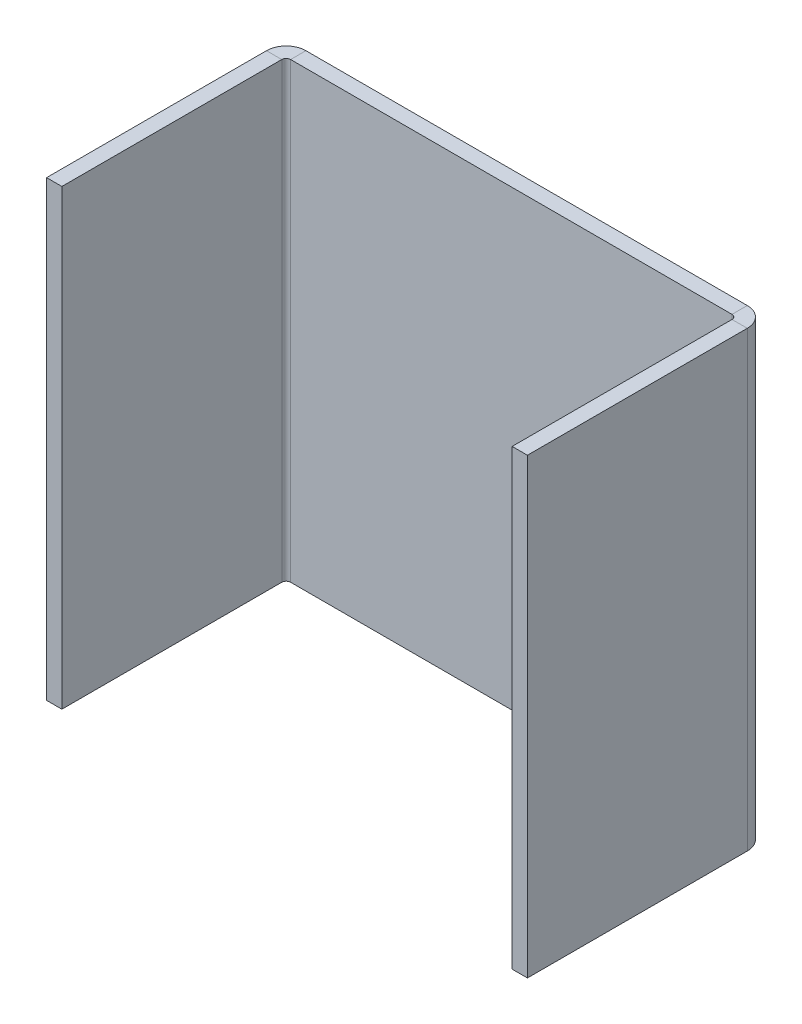
ISO-10303-21;
HEADER;
FILE_DESCRIPTION(('STEP AP214'),'2;1');
FILE_NAME('part.step','',(''),(''),'','','');
FILE_SCHEMA(('AUTOMOTIVE_DESIGN { 1 0 10303 214 1 1 1 1 }'));
ENDSEC;
DATA;
#1=APPLICATION_CONTEXT('core data for automotive mechanical design processes');
#2=APPLICATION_PROTOCOL_DEFINITION('international standard','automotive_design',2000,#1);
#3=PRODUCT_CONTEXT('',#1,'mechanical');
#4=PRODUCT('Part','Part','',(#3));
#5=PRODUCT_RELATED_PRODUCT_CATEGORY('part','',(#4));
#6=PRODUCT_DEFINITION_FORMATION('','',#4);
#7=PRODUCT_DEFINITION_CONTEXT('part definition',#1,'design');
#8=PRODUCT_DEFINITION('design','',#6,#7);
#9=PRODUCT_DEFINITION_SHAPE('','',#8);
#10=(LENGTH_UNIT() NAMED_UNIT(*) SI_UNIT(.MILLI.,.METRE.));
#11=(NAMED_UNIT(*) PLANE_ANGLE_UNIT() SI_UNIT($,.RADIAN.));
#12=(NAMED_UNIT(*) SI_UNIT($,.STERADIAN.) SOLID_ANGLE_UNIT());
#13=UNCERTAINTY_MEASURE_WITH_UNIT(LENGTH_MEASURE(1.E-05),#10,'distance_accuracy_value','');
#14=(GEOMETRIC_REPRESENTATION_CONTEXT(3) GLOBAL_UNCERTAINTY_ASSIGNED_CONTEXT((#13)) GLOBAL_UNIT_ASSIGNED_CONTEXT((#10,
#11,#12)) REPRESENTATION_CONTEXT('',''));
#15=CARTESIAN_POINT('',(0.,0.,0.));
#16=DIRECTION('',(0.,0.,1.));
#17=DIRECTION('',(1.,0.,0.));
#18=AXIS2_PLACEMENT_3D('',#15,#16,#17);
#19=CARTESIAN_POINT('',(76.3360875618202,37.6033561750832,-2.54));
#20=DIRECTION('',(0.,1.,0.));
#21=DIRECTION('',(0.,0.,1.));
#22=AXIS2_PLACEMENT_3D('',#19,#20,#21);
#23=PLANE('',#22);
#24=DIRECTION('',(-1.,0.,0.));
#25=VECTOR('',#24,1.);
#26=CARTESIAN_POINT('',(76.3360875618202,37.6033561750832,0.));
#27=LINE('',#26,#25);
#28=CARTESIAN_POINT('',(36.6601076071468,37.6033561750832,0.));
#29=VERTEX_POINT('',#28);
#30=CARTESIAN_POINT('',(-36.6601076071468,37.6033561750832,0.));
#31=VERTEX_POINT('',#30);
#32=EDGE_CURVE('E72',#29,#31,#27,.T.);
#33=ORIENTED_EDGE('',*,*,#32,.F.);
#34=DIRECTION('',(0.,0.,-1.));
#35=VECTOR('',#34,1.);
#36=CARTESIAN_POINT('',(36.6601076071468,37.6033561750832,-2.54));
#37=LINE('',#36,#35);
#38=CARTESIAN_POINT('',(36.6601076071469,37.6033561750832,-2.54));
#39=VERTEX_POINT('',#38);
#40=EDGE_CURVE('E243',#29,#39,#37,.T.);
#41=ORIENTED_EDGE('',*,*,#40,.T.);
#42=DIRECTION('',(-1.,0.,0.));
#43=VECTOR('',#42,1.);
#44=CARTESIAN_POINT('',(76.3360875618202,37.6033561750832,-2.54));
#45=LINE('',#44,#43);
#46=CARTESIAN_POINT('',(-36.6601076071468,37.6033561750832,-2.54));
#47=VERTEX_POINT('',#46);
#48=EDGE_CURVE('E51',#39,#47,#45,.T.);
#49=ORIENTED_EDGE('',*,*,#48,.T.);
#50=DIRECTION('',(0.,0.,-1.));
#51=VECTOR('',#50,1.);
#52=CARTESIAN_POINT('',(-36.6601076071469,37.6033561750832,-2.54));
#53=LINE('',#52,#51);
#54=EDGE_CURVE('E238',#31,#47,#53,.T.);
#55=ORIENTED_EDGE('',*,*,#54,.F.);
#56=EDGE_LOOP('',(#33,#41,#49,#55));
#57=FACE_BOUND('',#56,.T.);
#58=ADVANCED_FACE('F47',(#57),#23,.T.);
#59=CARTESIAN_POINT('',(76.3360875618202,-37.6033561750832,-2.54));
#60=DIRECTION('',(0.,-1.,0.));
#61=DIRECTION('',(0.,0.,-1.));
#62=AXIS2_PLACEMENT_3D('',#59,#60,#61);
#63=PLANE('',#62);
#64=DIRECTION('',(1.,0.,0.));
#65=VECTOR('',#64,1.);
#66=CARTESIAN_POINT('',(76.3360875618202,-37.6033561750832,-2.54));
#67=LINE('',#66,#65);
#68=CARTESIAN_POINT('',(-36.6601076071468,-37.6033561750832,-2.54));
#69=VERTEX_POINT('',#68);
#70=CARTESIAN_POINT('',(36.6601076071469,-37.6033561750832,-2.54));
#71=VERTEX_POINT('',#70);
#72=EDGE_CURVE('E247',#69,#71,#67,.T.);
#73=ORIENTED_EDGE('',*,*,#72,.T.);
#74=DIRECTION('',(0.,0.,1.));
#75=VECTOR('',#74,1.);
#76=CARTESIAN_POINT('',(36.6601076071469,-37.6033561750832,-2.54));
#77=LINE('',#76,#75);
#78=CARTESIAN_POINT('',(36.6601076071469,-37.6033561750832,0.));
#79=VERTEX_POINT('',#78);
#80=EDGE_CURVE('E12',#71,#79,#77,.T.);
#81=ORIENTED_EDGE('',*,*,#80,.T.);
#82=DIRECTION('',(1.,0.,0.));
#83=VECTOR('',#82,1.);
#84=CARTESIAN_POINT('',(76.3360875618202,-37.6033561750832,0.));
#85=LINE('',#84,#83);
#86=CARTESIAN_POINT('',(-36.6601076071468,-37.6033561750832,0.));
#87=VERTEX_POINT('',#86);
#88=EDGE_CURVE('E225',#87,#79,#85,.T.);
#89=ORIENTED_EDGE('',*,*,#88,.F.);
#90=DIRECTION('',(0.,0.,1.));
#91=VECTOR('',#90,1.);
#92=CARTESIAN_POINT('',(-36.6601076071468,-37.6033561750832,-2.54));
#93=LINE('',#92,#91);
#94=EDGE_CURVE('E232',#69,#87,#93,.T.);
#95=ORIENTED_EDGE('',*,*,#94,.F.);
#96=EDGE_LOOP('',(#73,#81,#89,#95));
#97=FACE_BOUND('',#96,.T.);
#98=ADVANCED_FACE('F49',(#97),#63,.T.);
#99=CARTESIAN_POINT('',(0.,0.,0.));
#100=DIRECTION('',(0.,0.,1.));
#101=DIRECTION('',(1.,0.,0.));
#102=AXIS2_PLACEMENT_3D('',#99,#100,#101);
#103=PLANE('',#102);
#104=ORIENTED_EDGE('',*,*,#88,.T.);
#105=DIRECTION('',(0.,1.,0.));
#106=VECTOR('',#105,1.);
#107=CARTESIAN_POINT('',(36.6601076071469,0.,0.));
#108=LINE('',#107,#106);
#109=EDGE_CURVE('E56',#79,#29,#108,.T.);
#110=ORIENTED_EDGE('',*,*,#109,.T.);
#111=ORIENTED_EDGE('',*,*,#32,.T.);
#112=DIRECTION('',(0.,1.,0.));
#113=VECTOR('',#112,1.);
#114=CARTESIAN_POINT('',(-36.6601076071468,0.,0.));
#115=LINE('',#114,#113);
#116=EDGE_CURVE('E235',#87,#31,#115,.T.);
#117=ORIENTED_EDGE('',*,*,#116,.F.);
#118=EDGE_LOOP('',(#104,#110,#111,#117));
#119=FACE_BOUND('',#118,.T.);
#120=ADVANCED_FACE('F251',(#119),#103,.T.);
#121=CARTESIAN_POINT('',(0.,0.,-2.54));
#122=DIRECTION('',(0.,0.,1.));
#123=DIRECTION('',(1.,0.,0.));
#124=AXIS2_PLACEMENT_3D('',#121,#122,#123);
#125=PLANE('',#124);
#126=DIRECTION('',(0.,1.,0.));
#127=VECTOR('',#126,1.);
#128=CARTESIAN_POINT('',(36.6601076071469,0.,-2.54));
#129=LINE('',#128,#127);
#130=EDGE_CURVE('E241',#71,#39,#129,.T.);
#131=ORIENTED_EDGE('',*,*,#130,.F.);
#132=ORIENTED_EDGE('',*,*,#72,.F.);
#133=DIRECTION('',(0.,1.,0.));
#134=VECTOR('',#133,1.);
#135=CARTESIAN_POINT('',(-36.6601076071468,0.,-2.54));
#136=LINE('',#135,#134);
#137=EDGE_CURVE('E230',#69,#47,#136,.T.);
#138=ORIENTED_EDGE('',*,*,#137,.T.);
#139=ORIENTED_EDGE('',*,*,#48,.F.);
#140=EDGE_LOOP('',(#131,#132,#138,#139));
#141=FACE_BOUND('',#140,.T.);
#142=ADVANCED_FACE('F262',(#141),#125,.F.);
#143=CARTESIAN_POINT('',(-36.6601076071468,-37.6033561750832,0.7366));
#144=DIRECTION('',(0.,-1.,0.));
#145=DIRECTION('',(0.,0.,-1.));
#146=AXIS2_PLACEMENT_3D('',#143,#144,#145);
#147=PLANE('',#146);
#148=ORIENTED_EDGE('',*,*,#94,.T.);
#149=CARTESIAN_POINT('',(-36.6601076071468,-37.6033561750832,0.7366));
#150=DIRECTION('',(0.,1.,0.));
#151=DIRECTION('',(-1.,0.,0.));
#152=AXIS2_PLACEMENT_3D('',#149,#150,#151);
#153=CIRCLE('',#152,0.7366);
#154=CARTESIAN_POINT('',(-37.3967076071468,-37.6033561750832,0.736600000000004));
#155=VERTEX_POINT('',#154);
#156=EDGE_CURVE('E190',#87,#155,#153,.T.);
#157=ORIENTED_EDGE('',*,*,#156,.T.);
#158=DIRECTION('',(1.,0.,0.));
#159=VECTOR('',#158,1.);
#160=CARTESIAN_POINT('',(-39.9367076071468,-37.6033561750832,0.736600000000011));
#161=LINE('',#160,#159);
#162=CARTESIAN_POINT('',(-39.9367076071468,-37.6033561750832,0.736600000000025));
#163=VERTEX_POINT('',#162);
#164=EDGE_CURVE('E205',#163,#155,#161,.T.);
#165=ORIENTED_EDGE('',*,*,#164,.F.);
#166=CARTESIAN_POINT('',(-36.6601076071468,-37.6033561750832,0.7366));
#167=DIRECTION('',(0.,1.,0.));
#168=DIRECTION('',(0.,0.,-1.));
#169=AXIS2_PLACEMENT_3D('',#166,#167,#168);
#170=CIRCLE('',#169,3.2766);
#171=EDGE_CURVE('E218',#69,#163,#170,.T.);
#172=ORIENTED_EDGE('',*,*,#171,.F.);
#173=EDGE_LOOP('',(#148,#157,#165,#172));
#174=FACE_BOUND('',#173,.T.);
#175=ADVANCED_FACE('F302',(#174),#147,.T.);
#176=CARTESIAN_POINT('',(-36.6601076071468,37.6033561750832,0.7366));
#177=DIRECTION('',(0.,1.,0.));
#178=DIRECTION('',(0.,0.,1.));
#179=AXIS2_PLACEMENT_3D('',#176,#177,#178);
#180=PLANE('',#179);
#181=DIRECTION('',(-1.,0.,0.));
#182=VECTOR('',#181,1.);
#183=CARTESIAN_POINT('',(-39.9367076071468,37.6033561750832,0.736600000000011));
#184=LINE('',#183,#182);
#185=CARTESIAN_POINT('',(-37.3967076071468,37.6033561750832,0.736600000000004));
#186=VERTEX_POINT('',#185);
#187=CARTESIAN_POINT('',(-39.9367076071469,37.6033561750832,0.736600000000017));
#188=VERTEX_POINT('',#187);
#189=EDGE_CURVE('E193',#186,#188,#184,.T.);
#190=ORIENTED_EDGE('',*,*,#189,.F.);
#191=CARTESIAN_POINT('',(-36.6601076071468,37.6033561750832,0.7366));
#192=DIRECTION('',(0.,1.,0.));
#193=DIRECTION('',(-1.,0.,0.));
#194=AXIS2_PLACEMENT_3D('',#191,#192,#193);
#195=CIRCLE('',#194,0.7366);
#196=EDGE_CURVE('E222',#186,#31,#195,.F.);
#197=ORIENTED_EDGE('',*,*,#196,.T.);
#198=ORIENTED_EDGE('',*,*,#54,.T.);
#199=CARTESIAN_POINT('',(-36.6601076071468,37.6033561750832,0.7366));
#200=DIRECTION('',(0.,-1.,0.));
#201=DIRECTION('',(0.,0.,1.));
#202=AXIS2_PLACEMENT_3D('',#199,#200,#201);
#203=CIRCLE('',#202,3.2766);
#204=EDGE_CURVE('E221',#188,#47,#203,.T.);
#205=ORIENTED_EDGE('',*,*,#204,.F.);
#206=EDGE_LOOP('',(#190,#197,#198,#205));
#207=FACE_BOUND('',#206,.T.);
#208=ADVANCED_FACE('F306',(#207),#180,.T.);
#209=CARTESIAN_POINT('',(-36.6601076071468,-75.315576302587,0.7366));
#210=DIRECTION('',(0.,1.,0.));
#211=DIRECTION('',(-1.,0.,0.));
#212=AXIS2_PLACEMENT_3D('',#209,#210,#211);
#213=CYLINDRICAL_SURFACE('',#212,3.2766);
#214=ORIENTED_EDGE('',*,*,#204,.T.);
#215=ORIENTED_EDGE('',*,*,#137,.F.);
#216=ORIENTED_EDGE('',*,*,#171,.T.);
#217=DIRECTION('',(0.,1.,0.));
#218=VECTOR('',#217,1.);
#219=CARTESIAN_POINT('',(-39.9367076071468,0.,0.736600000000018));
#220=LINE('',#219,#218);
#221=EDGE_CURVE('E183',#163,#188,#220,.T.);
#222=ORIENTED_EDGE('',*,*,#221,.T.);
#223=EDGE_LOOP('',(#214,#215,#216,#222));
#224=FACE_BOUND('',#223,.T.);
#225=ADVANCED_FACE('F311',(#224),#213,.T.);
#226=CARTESIAN_POINT('',(-36.6601076071468,-75.315576302587,0.7366));
#227=DIRECTION('',(0.,1.,0.));
#228=DIRECTION('',(-1.,0.,0.));
#229=AXIS2_PLACEMENT_3D('',#226,#227,#228);
#230=CYLINDRICAL_SURFACE('',#229,0.7366);
#231=ORIENTED_EDGE('',*,*,#196,.F.);
#232=DIRECTION('',(0.,1.,0.));
#233=VECTOR('',#232,1.);
#234=CARTESIAN_POINT('',(-37.3967076071468,0.,0.736600000000011));
#235=LINE('',#234,#233);
#236=EDGE_CURVE('E200',#155,#186,#235,.T.);
#237=ORIENTED_EDGE('',*,*,#236,.F.);
#238=ORIENTED_EDGE('',*,*,#156,.F.);
#239=ORIENTED_EDGE('',*,*,#116,.T.);
#240=EDGE_LOOP('',(#231,#237,#238,#239));
#241=FACE_BOUND('',#240,.T.);
#242=ADVANCED_FACE('F315',(#241),#230,.F.);
#243=CARTESIAN_POINT('',(-39.9367076071467,-37.6033561750832,37.2606200453267));
#244=DIRECTION('',(0.,0.,1.));
#245=DIRECTION('',(1.,0.,0.));
#246=AXIS2_PLACEMENT_3D('',#243,#244,#245);
#247=PLANE('',#246);
#248=DIRECTION('',(0.,-1.,0.));
#249=VECTOR('',#248,1.);
#250=CARTESIAN_POINT('',(-37.3967076071467,-37.6033561750832,37.2606200453267));
#251=LINE('',#250,#249);
#252=CARTESIAN_POINT('',(-37.3967076071467,37.6033561750832,37.2606200453267));
#253=VERTEX_POINT('',#252);
#254=CARTESIAN_POINT('',(-37.3967076071467,-37.6033561750832,37.2606200453267));
#255=VERTEX_POINT('',#254);
#256=EDGE_CURVE('E195',#253,#255,#251,.T.);
#257=ORIENTED_EDGE('',*,*,#256,.F.);
#258=DIRECTION('',(1.,0.,0.));
#259=VECTOR('',#258,1.);
#260=CARTESIAN_POINT('',(-39.9367076071467,37.6033561750832,37.2606200453267));
#261=LINE('',#260,#259);
#262=CARTESIAN_POINT('',(-39.9367076071467,37.6033561750832,37.2606200453267));
#263=VERTEX_POINT('',#262);
#264=EDGE_CURVE('E187',#263,#253,#261,.T.);
#265=ORIENTED_EDGE('',*,*,#264,.F.);
#266=DIRECTION('',(0.,-1.,0.));
#267=VECTOR('',#266,1.);
#268=CARTESIAN_POINT('',(-39.9367076071467,-37.6033561750832,37.2606200453267));
#269=LINE('',#268,#267);
#270=CARTESIAN_POINT('',(-39.9367076071467,-37.6033561750832,37.2606200453267));
#271=VERTEX_POINT('',#270);
#272=EDGE_CURVE('E213',#263,#271,#269,.T.);
#273=ORIENTED_EDGE('',*,*,#272,.T.);
#274=DIRECTION('',(1.,0.,0.));
#275=VECTOR('',#274,1.);
#276=CARTESIAN_POINT('',(-39.9367076071467,-37.6033561750832,37.2606200453267));
#277=LINE('',#276,#275);
#278=EDGE_CURVE('E211',#271,#255,#277,.T.);
#279=ORIENTED_EDGE('',*,*,#278,.T.);
#280=EDGE_LOOP('',(#257,#265,#273,#279));
#281=FACE_BOUND('',#280,.T.);
#282=ADVANCED_FACE('F318',(#281),#247,.T.);
#283=CARTESIAN_POINT('',(-39.936707607147,0.,-39.0754675164935));
#284=DIRECTION('',(1.,0.,0.));
#285=DIRECTION('',(0.,0.,-1.));
#286=AXIS2_PLACEMENT_3D('',#283,#284,#285);
#287=PLANE('',#286);
#288=ORIENTED_EDGE('',*,*,#221,.F.);
#289=DIRECTION('',(0.,0.,-1.));
#290=VECTOR('',#289,1.);
#291=CARTESIAN_POINT('',(-39.9367076071472,-37.6033561750832,-115.411555078314));
#292=LINE('',#291,#290);
#293=EDGE_CURVE('E208',#271,#163,#292,.T.);
#294=ORIENTED_EDGE('',*,*,#293,.F.);
#295=ORIENTED_EDGE('',*,*,#272,.F.);
#296=DIRECTION('',(0.,0.,1.));
#297=VECTOR('',#296,1.);
#298=CARTESIAN_POINT('',(-39.9367076071472,37.6033561750832,-115.411555078314));
#299=LINE('',#298,#297);
#300=EDGE_CURVE('E191',#188,#263,#299,.T.);
#301=ORIENTED_EDGE('',*,*,#300,.F.);
#302=EDGE_LOOP('',(#288,#294,#295,#301));
#303=FACE_BOUND('',#302,.T.);
#304=ADVANCED_FACE('F334',(#303),#287,.F.);
#305=CARTESIAN_POINT('',(-39.9367076071472,-37.6033561750832,-115.411555078314));
#306=DIRECTION('',(0.,-1.,0.));
#307=DIRECTION('',(-1.,0.,0.));
#308=AXIS2_PLACEMENT_3D('',#305,#306,#307);
#309=PLANE('',#308);
#310=ORIENTED_EDGE('',*,*,#293,.T.);
#311=ORIENTED_EDGE('',*,*,#164,.T.);
#312=DIRECTION('',(0.,0.,-1.));
#313=VECTOR('',#312,1.);
#314=CARTESIAN_POINT('',(-37.3967076071472,-37.6033561750832,-115.411555078314));
#315=LINE('',#314,#313);
#316=EDGE_CURVE('E203',#255,#155,#315,.T.);
#317=ORIENTED_EDGE('',*,*,#316,.F.);
#318=ORIENTED_EDGE('',*,*,#278,.F.);
#319=EDGE_LOOP('',(#310,#311,#317,#318));
#320=FACE_BOUND('',#319,.T.);
#321=ADVANCED_FACE('F330',(#320),#309,.T.);
#322=CARTESIAN_POINT('',(-37.396707607147,0.,-39.0754675164935));
#323=DIRECTION('',(1.,0.,0.));
#324=DIRECTION('',(0.,0.,-1.));
#325=AXIS2_PLACEMENT_3D('',#322,#323,#324);
#326=PLANE('',#325);
#327=ORIENTED_EDGE('',*,*,#316,.T.);
#328=ORIENTED_EDGE('',*,*,#236,.T.);
#329=DIRECTION('',(0.,0.,1.));
#330=VECTOR('',#329,1.);
#331=CARTESIAN_POINT('',(-37.3967076071472,37.6033561750832,-115.411555078314));
#332=LINE('',#331,#330);
#333=EDGE_CURVE('E198',#186,#253,#332,.T.);
#334=ORIENTED_EDGE('',*,*,#333,.T.);
#335=ORIENTED_EDGE('',*,*,#256,.T.);
#336=EDGE_LOOP('',(#327,#328,#334,#335));
#337=FACE_BOUND('',#336,.T.);
#338=ADVANCED_FACE('F326',(#337),#326,.T.);
#339=CARTESIAN_POINT('',(-39.9367076071472,37.6033561750832,-115.411555078314));
#340=DIRECTION('',(0.,1.,0.));
#341=DIRECTION('',(1.,0.,0.));
#342=AXIS2_PLACEMENT_3D('',#339,#340,#341);
#343=PLANE('',#342);
#344=ORIENTED_EDGE('',*,*,#333,.F.);
#345=ORIENTED_EDGE('',*,*,#189,.T.);
#346=ORIENTED_EDGE('',*,*,#300,.T.);
#347=ORIENTED_EDGE('',*,*,#264,.T.);
#348=EDGE_LOOP('',(#344,#345,#346,#347));
#349=FACE_BOUND('',#348,.T.);
#350=ADVANCED_FACE('F323',(#349),#343,.T.);
#351=CARTESIAN_POINT('',(36.6601076071469,-37.6033561750832,0.7366));
#352=DIRECTION('',(0.,-1.,0.));
#353=DIRECTION('',(0.,0.,-1.));
#354=AXIS2_PLACEMENT_3D('',#351,#352,#353);
#355=PLANE('',#354);
#356=DIRECTION('',(-1.,0.,0.));
#357=VECTOR('',#356,1.);
#358=CARTESIAN_POINT('',(39.9367076071469,-37.6033561750832,0.736600000000011));
#359=LINE('',#358,#357);
#360=CARTESIAN_POINT('',(39.9367076071469,-37.6033561750832,0.736600000000011));
#361=VERTEX_POINT('',#360);
#362=CARTESIAN_POINT('',(37.3967076071469,-37.6033561750832,0.73659999999999));
#363=VERTEX_POINT('',#362);
#364=EDGE_CURVE('E146',#361,#363,#359,.T.);
#365=ORIENTED_EDGE('',*,*,#364,.T.);
#366=CARTESIAN_POINT('',(36.6601076071469,-37.6033561750832,0.7366));
#367=DIRECTION('',(0.,-1.,0.));
#368=DIRECTION('',(1.,0.,0.));
#369=AXIS2_PLACEMENT_3D('',#366,#367,#368);
#370=CIRCLE('',#369,0.7366);
#371=EDGE_CURVE('E64',#363,#79,#370,.F.);
#372=ORIENTED_EDGE('',*,*,#371,.T.);
#373=ORIENTED_EDGE('',*,*,#80,.F.);
#374=CARTESIAN_POINT('',(36.6601076071469,-37.6033561750832,0.7366));
#375=DIRECTION('',(0.,1.,0.));
#376=DIRECTION('',(0.,0.,-1.));
#377=AXIS2_PLACEMENT_3D('',#374,#375,#376);
#378=CIRCLE('',#377,3.2766);
#379=EDGE_CURVE('E176',#361,#71,#378,.T.);
#380=ORIENTED_EDGE('',*,*,#379,.F.);
#381=EDGE_LOOP('',(#365,#372,#373,#380));
#382=FACE_BOUND('',#381,.T.);
#383=ADVANCED_FACE('F254',(#382),#355,.T.);
#384=CARTESIAN_POINT('',(36.6601076071468,37.6033561750832,0.7366));
#385=DIRECTION('',(0.,1.,0.));
#386=DIRECTION('',(0.,0.,1.));
#387=AXIS2_PLACEMENT_3D('',#384,#385,#386);
#388=PLANE('',#387);
#389=ORIENTED_EDGE('',*,*,#40,.F.);
#390=CARTESIAN_POINT('',(36.6601076071468,37.6033561750832,0.7366));
#391=DIRECTION('',(0.,-1.,0.));
#392=DIRECTION('',(1.,0.,0.));
#393=AXIS2_PLACEMENT_3D('',#390,#391,#392);
#394=CIRCLE('',#393,0.7366);
#395=CARTESIAN_POINT('',(37.3967076071468,37.6033561750832,0.736600000000018));
#396=VERTEX_POINT('',#395);
#397=EDGE_CURVE('E180',#29,#396,#394,.T.);
#398=ORIENTED_EDGE('',*,*,#397,.T.);
#399=DIRECTION('',(1.,0.,0.));
#400=VECTOR('',#399,1.);
#401=CARTESIAN_POINT('',(39.9367076071468,37.6033561750832,0.736600000000011));
#402=LINE('',#401,#400);
#403=CARTESIAN_POINT('',(39.9367076071469,37.6033561750832,0.73660000000004));
#404=VERTEX_POINT('',#403);
#405=EDGE_CURVE('E164',#396,#404,#402,.T.);
#406=ORIENTED_EDGE('',*,*,#405,.T.);
#407=CARTESIAN_POINT('',(36.6601076071468,37.6033561750832,0.7366));
#408=DIRECTION('',(0.,-1.,0.));
#409=DIRECTION('',(0.,0.,1.));
#410=AXIS2_PLACEMENT_3D('',#407,#408,#409);
#411=CIRCLE('',#410,3.2766);
#412=EDGE_CURVE('E179',#39,#404,#411,.T.);
#413=ORIENTED_EDGE('',*,*,#412,.F.);
#414=EDGE_LOOP('',(#389,#398,#406,#413));
#415=FACE_BOUND('',#414,.T.);
#416=ADVANCED_FACE('F268',(#415),#388,.T.);
#417=CARTESIAN_POINT('',(36.6601076071468,75.315576302587,0.7366));
#418=DIRECTION('',(0.,-1.,0.));
#419=DIRECTION('',(1.,0.,0.));
#420=AXIS2_PLACEMENT_3D('',#417,#418,#419);
#421=CYLINDRICAL_SURFACE('',#420,3.2766);
#422=ORIENTED_EDGE('',*,*,#412,.T.);
#423=DIRECTION('',(0.,1.,0.));
#424=VECTOR('',#423,1.);
#425=CARTESIAN_POINT('',(39.9367076071469,0.,0.736600000000011));
#426=LINE('',#425,#424);
#427=EDGE_CURVE('E166',#361,#404,#426,.T.);
#428=ORIENTED_EDGE('',*,*,#427,.F.);
#429=ORIENTED_EDGE('',*,*,#379,.T.);
#430=ORIENTED_EDGE('',*,*,#130,.T.);
#431=EDGE_LOOP('',(#422,#428,#429,#430));
#432=FACE_BOUND('',#431,.T.);
#433=ADVANCED_FACE('F258',(#432),#421,.T.);
#434=CARTESIAN_POINT('',(36.6601076071468,75.315576302587,0.7366));
#435=DIRECTION('',(0.,-1.,0.));
#436=DIRECTION('',(1.,0.,0.));
#437=AXIS2_PLACEMENT_3D('',#434,#435,#436);
#438=CYLINDRICAL_SURFACE('',#437,0.7366);
#439=ORIENTED_EDGE('',*,*,#397,.F.);
#440=ORIENTED_EDGE('',*,*,#109,.F.);
#441=ORIENTED_EDGE('',*,*,#371,.F.);
#442=DIRECTION('',(0.,1.,0.));
#443=VECTOR('',#442,1.);
#444=CARTESIAN_POINT('',(37.3967076071469,0.,0.736600000000004));
#445=LINE('',#444,#443);
#446=EDGE_CURVE('E169',#363,#396,#445,.T.);
#447=ORIENTED_EDGE('',*,*,#446,.T.);
#448=EDGE_LOOP('',(#439,#440,#441,#447));
#449=FACE_BOUND('',#448,.T.);
#450=ADVANCED_FACE('F270',(#449),#438,.F.);
#451=CARTESIAN_POINT('',(39.9367076071467,-37.6033561750832,37.2606200453267));
#452=DIRECTION('',(0.,0.,1.));
#453=DIRECTION('',(1.,0.,0.));
#454=AXIS2_PLACEMENT_3D('',#451,#452,#453);
#455=PLANE('',#454);
#456=DIRECTION('',(0.,1.,0.));
#457=VECTOR('',#456,1.);
#458=CARTESIAN_POINT('',(37.3967076071467,-37.6033561750832,37.2606200453267));
#459=LINE('',#458,#457);
#460=CARTESIAN_POINT('',(37.3967076071467,-37.6033561750832,37.2606200453267));
#461=VERTEX_POINT('',#460);
#462=CARTESIAN_POINT('',(37.3967076071467,37.6033561750832,37.2606200453267));
#463=VERTEX_POINT('',#462);
#464=EDGE_CURVE('E159',#461,#463,#459,.T.);
#465=ORIENTED_EDGE('',*,*,#464,.F.);
#466=DIRECTION('',(-1.,0.,0.));
#467=VECTOR('',#466,1.);
#468=CARTESIAN_POINT('',(39.9367076071467,-37.6033561750832,37.2606200453267));
#469=LINE('',#468,#467);
#470=CARTESIAN_POINT('',(39.9367076071467,-37.6033561750832,37.2606200453267));
#471=VERTEX_POINT('',#470);
#472=EDGE_CURVE('E144',#471,#461,#469,.T.);
#473=ORIENTED_EDGE('',*,*,#472,.F.);
#474=DIRECTION('',(0.,1.,0.));
#475=VECTOR('',#474,1.);
#476=CARTESIAN_POINT('',(39.9367076071467,-37.6033561750832,37.2606200453267));
#477=LINE('',#476,#475);
#478=CARTESIAN_POINT('',(39.9367076071467,37.6033561750832,37.2606200453267));
#479=VERTEX_POINT('',#478);
#480=EDGE_CURVE('E156',#471,#479,#477,.T.);
#481=ORIENTED_EDGE('',*,*,#480,.T.);
#482=DIRECTION('',(-1.,0.,0.));
#483=VECTOR('',#482,1.);
#484=CARTESIAN_POINT('',(39.9367076071467,37.6033561750832,37.2606200453267));
#485=LINE('',#484,#483);
#486=EDGE_CURVE('E163',#479,#463,#485,.T.);
#487=ORIENTED_EDGE('',*,*,#486,.T.);
#488=EDGE_LOOP('',(#465,#473,#481,#487));
#489=FACE_BOUND('',#488,.T.);
#490=ADVANCED_FACE('F155',(#489),#455,.T.);
#491=CARTESIAN_POINT('',(39.936707607147,0.,-39.0754675164935));
#492=DIRECTION('',(-1.,0.,0.));
#493=DIRECTION('',(0.,0.,1.));
#494=AXIS2_PLACEMENT_3D('',#491,#492,#493);
#495=PLANE('',#494);
#496=DIRECTION('',(0.,0.,1.));
#497=VECTOR('',#496,1.);
#498=CARTESIAN_POINT('',(39.9367076071467,-37.6033561750832,37.2606200453267));
#499=LINE('',#498,#497);
#500=EDGE_CURVE('E141',#361,#471,#499,.T.);
#501=ORIENTED_EDGE('',*,*,#500,.F.);
#502=ORIENTED_EDGE('',*,*,#427,.T.);
#503=DIRECTION('',(0.,0.,-1.));
#504=VECTOR('',#503,1.);
#505=CARTESIAN_POINT('',(39.9367076071467,37.6033561750832,37.2606200453267));
#506=LINE('',#505,#504);
#507=EDGE_CURVE('E162',#479,#404,#506,.T.);
#508=ORIENTED_EDGE('',*,*,#507,.F.);
#509=ORIENTED_EDGE('',*,*,#480,.F.);
#510=EDGE_LOOP('',(#501,#502,#508,#509));
#511=FACE_BOUND('',#510,.T.);
#512=ADVANCED_FACE('F161',(#511),#495,.F.);
#513=CARTESIAN_POINT('',(39.9367076071467,37.6033561750832,37.2606200453267));
#514=DIRECTION('',(0.,1.,0.));
#515=DIRECTION('',(-1.,0.,0.));
#516=AXIS2_PLACEMENT_3D('',#513,#514,#515);
#517=PLANE('',#516);
#518=ORIENTED_EDGE('',*,*,#405,.F.);
#519=DIRECTION('',(0.,0.,-1.));
#520=VECTOR('',#519,1.);
#521=CARTESIAN_POINT('',(37.3967076071467,37.6033561750832,37.2606200453267));
#522=LINE('',#521,#520);
#523=EDGE_CURVE('E151',#463,#396,#522,.T.);
#524=ORIENTED_EDGE('',*,*,#523,.F.);
#525=ORIENTED_EDGE('',*,*,#486,.F.);
#526=ORIENTED_EDGE('',*,*,#507,.T.);
#527=EDGE_LOOP('',(#518,#524,#525,#526));
#528=FACE_BOUND('',#527,.T.);
#529=ADVANCED_FACE('F279',(#528),#517,.T.);
#530=CARTESIAN_POINT('',(37.396707607147,0.,-39.0754675164935));
#531=DIRECTION('',(-1.,0.,0.));
#532=DIRECTION('',(0.,0.,1.));
#533=AXIS2_PLACEMENT_3D('',#530,#531,#532);
#534=PLANE('',#533);
#535=ORIENTED_EDGE('',*,*,#446,.F.);
#536=DIRECTION('',(0.,0.,1.));
#537=VECTOR('',#536,1.);
#538=CARTESIAN_POINT('',(37.3967076071467,-37.6033561750832,37.2606200453267));
#539=LINE('',#538,#537);
#540=EDGE_CURVE('E274',#363,#461,#539,.T.);
#541=ORIENTED_EDGE('',*,*,#540,.T.);
#542=ORIENTED_EDGE('',*,*,#464,.T.);
#543=ORIENTED_EDGE('',*,*,#523,.T.);
#544=EDGE_LOOP('',(#535,#541,#542,#543));
#545=FACE_BOUND('',#544,.T.);
#546=ADVANCED_FACE('F273',(#545),#534,.T.);
#547=CARTESIAN_POINT('',(39.9367076071467,-37.6033561750832,37.2606200453267));
#548=DIRECTION('',(0.,-1.,0.));
#549=DIRECTION('',(1.,0.,0.));
#550=AXIS2_PLACEMENT_3D('',#547,#548,#549);
#551=PLANE('',#550);
#552=ORIENTED_EDGE('',*,*,#364,.F.);
#553=ORIENTED_EDGE('',*,*,#500,.T.);
#554=ORIENTED_EDGE('',*,*,#472,.T.);
#555=ORIENTED_EDGE('',*,*,#540,.F.);
#556=EDGE_LOOP('',(#552,#553,#554,#555));
#557=FACE_BOUND('',#556,.T.);
#558=ADVANCED_FACE('F143',(#557),#551,.T.);
#559=CLOSED_SHELL('',(#58,#98,#120,#142,#175,#208,#225,#242,#282,#304,#321,#338,#350,#383,#416,
#433,#450,#490,#512,#529,#546,#558));
#560=MANIFOLD_SOLID_BREP('B2',#559);
#561=ADVANCED_BREP_SHAPE_REPRESENTATION('',(#18,#560),#14);
#562=SHAPE_DEFINITION_REPRESENTATION(#9,#561);
ENDSEC;
END-ISO-10303-21;
